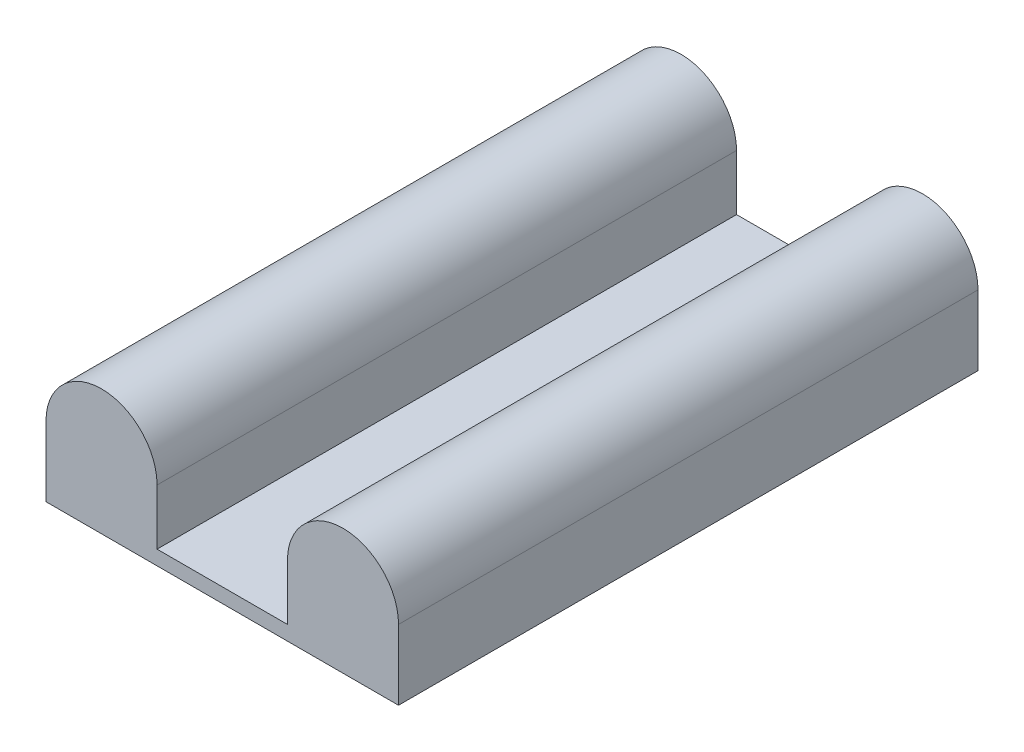
ISO-10303-21;
HEADER;
FILE_DESCRIPTION(('STEP AP214'),'2;1');
FILE_NAME('part.step','',(''),(''),'','','');
FILE_SCHEMA(('AUTOMOTIVE_DESIGN { 1 0 10303 214 1 1 1 1 }'));
ENDSEC;
DATA;
#1=APPLICATION_CONTEXT('core data for automotive mechanical design processes');
#2=APPLICATION_PROTOCOL_DEFINITION('international standard','automotive_design',2000,#1);
#3=PRODUCT_CONTEXT('',#1,'mechanical');
#4=PRODUCT('Part','Part','',(#3));
#5=PRODUCT_RELATED_PRODUCT_CATEGORY('part','',(#4));
#6=PRODUCT_DEFINITION_FORMATION('','',#4);
#7=PRODUCT_DEFINITION_CONTEXT('part definition',#1,'design');
#8=PRODUCT_DEFINITION('design','',#6,#7);
#9=PRODUCT_DEFINITION_SHAPE('','',#8);
#10=(LENGTH_UNIT() NAMED_UNIT(*) SI_UNIT(.MILLI.,.METRE.));
#11=(NAMED_UNIT(*) PLANE_ANGLE_UNIT() SI_UNIT($,.RADIAN.));
#12=(NAMED_UNIT(*) SI_UNIT($,.STERADIAN.) SOLID_ANGLE_UNIT());
#13=UNCERTAINTY_MEASURE_WITH_UNIT(LENGTH_MEASURE(1.E-05),#10,'distance_accuracy_value','');
#14=(GEOMETRIC_REPRESENTATION_CONTEXT(3) GLOBAL_UNCERTAINTY_ASSIGNED_CONTEXT((#13)) GLOBAL_UNIT_ASSIGNED_CONTEXT((#10,
#11,#12)) REPRESENTATION_CONTEXT('',''));
#15=CARTESIAN_POINT('',(0.,0.,0.));
#16=DIRECTION('',(0.,0.,1.));
#17=DIRECTION('',(1.,0.,0.));
#18=AXIS2_PLACEMENT_3D('',#15,#16,#17);
#19=CARTESIAN_POINT('',(0.,0.,120.));
#20=DIRECTION('',(0.,0.,-1.));
#21=DIRECTION('',(-1.,0.,0.));
#22=AXIS2_PLACEMENT_3D('',#19,#20,#21);
#23=CYLINDRICAL_SURFACE('',#22,11.5);
#24=CARTESIAN_POINT('',(0.,0.,0.));
#25=DIRECTION('',(0.,0.,1.));
#26=DIRECTION('',(1.,0.,0.));
#27=AXIS2_PLACEMENT_3D('',#24,#25,#26);
#28=CIRCLE('',#27,11.5);
#29=CARTESIAN_POINT('',(11.5,0.,0.));
#30=VERTEX_POINT('',#29);
#31=CARTESIAN_POINT('',(-11.5,0.,0.));
#32=VERTEX_POINT('',#31);
#33=EDGE_CURVE('E169',#30,#32,#28,.T.);
#34=ORIENTED_EDGE('',*,*,#33,.T.);
#35=DIRECTION('',(0.,0.,-1.));
#36=VECTOR('',#35,1.);
#37=CARTESIAN_POINT('',(-11.5,0.,120.));
#38=LINE('',#37,#36);
#39=CARTESIAN_POINT('',(-11.5,0.,120.));
#40=VERTEX_POINT('',#39);
#41=EDGE_CURVE('E102',#40,#32,#38,.T.);
#42=ORIENTED_EDGE('',*,*,#41,.F.);
#43=CARTESIAN_POINT('',(0.,0.,120.));
#44=DIRECTION('',(0.,0.,1.));
#45=DIRECTION('',(1.,0.,0.));
#46=AXIS2_PLACEMENT_3D('',#43,#44,#45);
#47=CIRCLE('',#46,11.5);
#48=CARTESIAN_POINT('',(11.5,0.,120.));
#49=VERTEX_POINT('',#48);
#50=EDGE_CURVE('E214',#49,#40,#47,.T.);
#51=ORIENTED_EDGE('',*,*,#50,.F.);
#52=DIRECTION('',(0.,0.,-1.));
#53=VECTOR('',#52,1.);
#54=CARTESIAN_POINT('',(11.5,0.,120.));
#55=LINE('',#54,#53);
#56=EDGE_CURVE('E12',#49,#30,#55,.T.);
#57=ORIENTED_EDGE('',*,*,#56,.T.);
#58=EDGE_LOOP('',(#34,#42,#51,#57));
#59=FACE_BOUND('',#58,.T.);
#60=ADVANCED_FACE('F92',(#59),#23,.T.);
#61=CARTESIAN_POINT('',(-11.5,0.,120.));
#62=DIRECTION('',(-1.,0.,0.));
#63=DIRECTION('',(0.,0.,1.));
#64=AXIS2_PLACEMENT_3D('',#61,#62,#63);
#65=PLANE('',#64);
#66=DIRECTION('',(0.,1.,0.));
#67=VECTOR('',#66,1.);
#68=CARTESIAN_POINT('',(-11.5,0.,0.));
#69=LINE('',#68,#67);
#70=CARTESIAN_POINT('',(-11.5,-14.5,0.));
#71=VERTEX_POINT('',#70);
#72=EDGE_CURVE('E159',#71,#32,#69,.T.);
#73=ORIENTED_EDGE('',*,*,#72,.F.);
#74=DIRECTION('',(0.,0.,-1.));
#75=VECTOR('',#74,1.);
#76=CARTESIAN_POINT('',(-11.5,-14.5,120.));
#77=LINE('',#76,#75);
#78=CARTESIAN_POINT('',(-11.5,-14.5,120.));
#79=VERTEX_POINT('',#78);
#80=EDGE_CURVE('E163',#79,#71,#77,.T.);
#81=ORIENTED_EDGE('',*,*,#80,.F.);
#82=DIRECTION('',(0.,1.,0.));
#83=VECTOR('',#82,1.);
#84=CARTESIAN_POINT('',(-11.5,0.,120.));
#85=LINE('',#84,#83);
#86=EDGE_CURVE('E209',#79,#40,#85,.T.);
#87=ORIENTED_EDGE('',*,*,#86,.T.);
#88=ORIENTED_EDGE('',*,*,#41,.T.);
#89=EDGE_LOOP('',(#73,#81,#87,#88));
#90=FACE_BOUND('',#89,.T.);
#91=ADVANCED_FACE('F161',(#90),#65,.T.);
#92=CARTESIAN_POINT('',(11.5,0.,120.));
#93=DIRECTION('',(1.,0.,0.));
#94=DIRECTION('',(0.,0.,-1.));
#95=AXIS2_PLACEMENT_3D('',#92,#93,#94);
#96=PLANE('',#95);
#97=DIRECTION('',(0.,-1.,0.));
#98=VECTOR('',#97,1.);
#99=CARTESIAN_POINT('',(11.5,0.,0.));
#100=LINE('',#99,#98);
#101=CARTESIAN_POINT('',(11.5,-11.5,0.));
#102=VERTEX_POINT('',#101);
#103=EDGE_CURVE('E188',#30,#102,#100,.T.);
#104=ORIENTED_EDGE('',*,*,#103,.F.);
#105=ORIENTED_EDGE('',*,*,#56,.F.);
#106=DIRECTION('',(0.,-1.,0.));
#107=VECTOR('',#106,1.);
#108=CARTESIAN_POINT('',(11.5,0.,120.));
#109=LINE('',#108,#107);
#110=CARTESIAN_POINT('',(11.5,-11.5,120.));
#111=VERTEX_POINT('',#110);
#112=EDGE_CURVE('E168',#49,#111,#109,.T.);
#113=ORIENTED_EDGE('',*,*,#112,.T.);
#114=DIRECTION('',(0.,0.,-1.));
#115=VECTOR('',#114,1.);
#116=CARTESIAN_POINT('',(11.5,-11.5,120.));
#117=LINE('',#116,#115);
#118=EDGE_CURVE('E111',#111,#102,#117,.T.);
#119=ORIENTED_EDGE('',*,*,#118,.T.);
#120=EDGE_LOOP('',(#104,#105,#113,#119));
#121=FACE_BOUND('',#120,.T.);
#122=ADVANCED_FACE('F221',(#121),#96,.T.);
#123=CARTESIAN_POINT('',(0.,0.,0.));
#124=DIRECTION('',(0.,0.,1.));
#125=DIRECTION('',(1.,0.,0.));
#126=AXIS2_PLACEMENT_3D('',#123,#124,#125);
#127=PLANE('',#126);
#128=ORIENTED_EDGE('',*,*,#103,.T.);
#129=DIRECTION('',(1.,0.,0.));
#130=VECTOR('',#129,1.);
#131=CARTESIAN_POINT('',(-11.5,-11.5,0.));
#132=LINE('',#131,#130);
#133=CARTESIAN_POINT('',(38.5,-11.5,0.));
#134=VERTEX_POINT('',#133);
#135=EDGE_CURVE('E180',#102,#134,#132,.T.);
#136=ORIENTED_EDGE('',*,*,#135,.T.);
#137=DIRECTION('',(0.,-1.,0.));
#138=VECTOR('',#137,1.);
#139=CARTESIAN_POINT('',(38.5,0.,0.));
#140=LINE('',#139,#138);
#141=CARTESIAN_POINT('',(38.5,0.,0.));
#142=VERTEX_POINT('',#141);
#143=EDGE_CURVE('E196',#142,#134,#140,.T.);
#144=ORIENTED_EDGE('',*,*,#143,.F.);
#145=CARTESIAN_POINT('',(50.,0.,0.));
#146=DIRECTION('',(0.,0.,1.));
#147=DIRECTION('',(1.,0.,0.));
#148=AXIS2_PLACEMENT_3D('',#145,#146,#147);
#149=CIRCLE('',#148,11.5);
#150=CARTESIAN_POINT('',(61.5,0.,0.));
#151=VERTEX_POINT('',#150);
#152=EDGE_CURVE('E200',#151,#142,#149,.T.);
#153=ORIENTED_EDGE('',*,*,#152,.F.);
#154=DIRECTION('',(0.,-1.,0.));
#155=VECTOR('',#154,1.);
#156=CARTESIAN_POINT('',(61.5,0.,0.));
#157=LINE('',#156,#155);
#158=CARTESIAN_POINT('',(61.5,-14.5,0.));
#159=VERTEX_POINT('',#158);
#160=EDGE_CURVE('E153',#151,#159,#157,.T.);
#161=ORIENTED_EDGE('',*,*,#160,.T.);
#162=DIRECTION('',(1.,0.,0.));
#163=VECTOR('',#162,1.);
#164=CARTESIAN_POINT('',(-11.5,-14.5,0.));
#165=LINE('',#164,#163);
#166=EDGE_CURVE('E174',#71,#159,#165,.T.);
#167=ORIENTED_EDGE('',*,*,#166,.F.);
#168=ORIENTED_EDGE('',*,*,#72,.T.);
#169=ORIENTED_EDGE('',*,*,#33,.F.);
#170=EDGE_LOOP('',(#128,#136,#144,#153,#161,#167,#168,#169));
#171=FACE_BOUND('',#170,.T.);
#172=ADVANCED_FACE('F179',(#171),#127,.F.);
#173=CARTESIAN_POINT('',(0.,0.,120.));
#174=DIRECTION('',(0.,0.,1.));
#175=DIRECTION('',(1.,0.,0.));
#176=AXIS2_PLACEMENT_3D('',#173,#174,#175);
#177=PLANE('',#176);
#178=ORIENTED_EDGE('',*,*,#112,.F.);
#179=ORIENTED_EDGE('',*,*,#50,.T.);
#180=ORIENTED_EDGE('',*,*,#86,.F.);
#181=DIRECTION('',(1.,0.,0.));
#182=VECTOR('',#181,1.);
#183=CARTESIAN_POINT('',(-11.5,-14.5,120.));
#184=LINE('',#183,#182);
#185=CARTESIAN_POINT('',(61.5,-14.5,120.));
#186=VERTEX_POINT('',#185);
#187=EDGE_CURVE('E176',#79,#186,#184,.T.);
#188=ORIENTED_EDGE('',*,*,#187,.T.);
#189=DIRECTION('',(0.,-1.,0.));
#190=VECTOR('',#189,1.);
#191=CARTESIAN_POINT('',(61.5,0.,120.));
#192=LINE('',#191,#190);
#193=CARTESIAN_POINT('',(61.5,0.,120.));
#194=VERTEX_POINT('',#193);
#195=EDGE_CURVE('E199',#194,#186,#192,.T.);
#196=ORIENTED_EDGE('',*,*,#195,.F.);
#197=CARTESIAN_POINT('',(50.,0.,120.));
#198=DIRECTION('',(0.,0.,1.));
#199=DIRECTION('',(1.,0.,0.));
#200=AXIS2_PLACEMENT_3D('',#197,#198,#199);
#201=CIRCLE('',#200,11.5);
#202=CARTESIAN_POINT('',(38.5,0.,120.));
#203=VERTEX_POINT('',#202);
#204=EDGE_CURVE('E205',#194,#203,#201,.T.);
#205=ORIENTED_EDGE('',*,*,#204,.T.);
#206=DIRECTION('',(0.,-1.,0.));
#207=VECTOR('',#206,1.);
#208=CARTESIAN_POINT('',(38.5,0.,120.));
#209=LINE('',#208,#207);
#210=CARTESIAN_POINT('',(38.5,-11.5,120.));
#211=VERTEX_POINT('',#210);
#212=EDGE_CURVE('E195',#203,#211,#209,.T.);
#213=ORIENTED_EDGE('',*,*,#212,.T.);
#214=DIRECTION('',(1.,0.,0.));
#215=VECTOR('',#214,1.);
#216=CARTESIAN_POINT('',(-11.5,-11.5,120.));
#217=LINE('',#216,#215);
#218=EDGE_CURVE('E177',#111,#211,#217,.T.);
#219=ORIENTED_EDGE('',*,*,#218,.F.);
#220=EDGE_LOOP('',(#178,#179,#180,#188,#196,#205,#213,#219));
#221=FACE_BOUND('',#220,.T.);
#222=ADVANCED_FACE('F224',(#221),#177,.T.);
#223=CARTESIAN_POINT('',(61.5,0.,120.));
#224=DIRECTION('',(1.,0.,0.));
#225=DIRECTION('',(0.,0.,-1.));
#226=AXIS2_PLACEMENT_3D('',#223,#224,#225);
#227=PLANE('',#226);
#228=ORIENTED_EDGE('',*,*,#160,.F.);
#229=DIRECTION('',(0.,0.,-1.));
#230=VECTOR('',#229,1.);
#231=CARTESIAN_POINT('',(61.5,0.,120.));
#232=LINE('',#231,#230);
#233=EDGE_CURVE('E186',#194,#151,#232,.T.);
#234=ORIENTED_EDGE('',*,*,#233,.F.);
#235=ORIENTED_EDGE('',*,*,#195,.T.);
#236=DIRECTION('',(0.,0.,-1.));
#237=VECTOR('',#236,1.);
#238=CARTESIAN_POINT('',(61.5,-14.5,120.));
#239=LINE('',#238,#237);
#240=EDGE_CURVE('E96',#186,#159,#239,.T.);
#241=ORIENTED_EDGE('',*,*,#240,.T.);
#242=EDGE_LOOP('',(#228,#234,#235,#241));
#243=FACE_BOUND('',#242,.T.);
#244=ADVANCED_FACE('F235',(#243),#227,.T.);
#245=CARTESIAN_POINT('',(50.,0.,120.));
#246=DIRECTION('',(0.,0.,-1.));
#247=DIRECTION('',(-1.,0.,0.));
#248=AXIS2_PLACEMENT_3D('',#245,#246,#247);
#249=CYLINDRICAL_SURFACE('',#248,11.5);
#250=ORIENTED_EDGE('',*,*,#152,.T.);
#251=DIRECTION('',(0.,0.,-1.));
#252=VECTOR('',#251,1.);
#253=CARTESIAN_POINT('',(38.5,0.,120.));
#254=LINE('',#253,#252);
#255=EDGE_CURVE('E189',#203,#142,#254,.T.);
#256=ORIENTED_EDGE('',*,*,#255,.F.);
#257=ORIENTED_EDGE('',*,*,#204,.F.);
#258=ORIENTED_EDGE('',*,*,#233,.T.);
#259=EDGE_LOOP('',(#250,#256,#257,#258));
#260=FACE_BOUND('',#259,.T.);
#261=ADVANCED_FACE('F238',(#260),#249,.T.);
#262=CARTESIAN_POINT('',(38.5,0.,120.));
#263=DIRECTION('',(1.,0.,0.));
#264=DIRECTION('',(0.,0.,-1.));
#265=AXIS2_PLACEMENT_3D('',#262,#263,#264);
#266=PLANE('',#265);
#267=ORIENTED_EDGE('',*,*,#143,.T.);
#268=DIRECTION('',(0.,0.,-1.));
#269=VECTOR('',#268,1.);
#270=CARTESIAN_POINT('',(38.5,-11.5,120.));
#271=LINE('',#270,#269);
#272=EDGE_CURVE('E192',#211,#134,#271,.T.);
#273=ORIENTED_EDGE('',*,*,#272,.F.);
#274=ORIENTED_EDGE('',*,*,#212,.F.);
#275=ORIENTED_EDGE('',*,*,#255,.T.);
#276=EDGE_LOOP('',(#267,#273,#274,#275));
#277=FACE_BOUND('',#276,.T.);
#278=ADVANCED_FACE('F229',(#277),#266,.F.);
#279=CARTESIAN_POINT('',(-11.5,-11.5,120.));
#280=DIRECTION('',(0.,1.,0.));
#281=DIRECTION('',(-1.,0.,0.));
#282=AXIS2_PLACEMENT_3D('',#279,#280,#281);
#283=PLANE('',#282);
#284=ORIENTED_EDGE('',*,*,#118,.F.);
#285=ORIENTED_EDGE('',*,*,#218,.T.);
#286=ORIENTED_EDGE('',*,*,#272,.T.);
#287=ORIENTED_EDGE('',*,*,#135,.F.);
#288=EDGE_LOOP('',(#284,#285,#286,#287));
#289=FACE_BOUND('',#288,.T.);
#290=ADVANCED_FACE('F227',(#289),#283,.T.);
#291=CARTESIAN_POINT('',(-11.5,-14.5,120.));
#292=DIRECTION('',(0.,1.,0.));
#293=DIRECTION('',(-1.,0.,0.));
#294=AXIS2_PLACEMENT_3D('',#291,#292,#293);
#295=PLANE('',#294);
#296=ORIENTED_EDGE('',*,*,#166,.T.);
#297=ORIENTED_EDGE('',*,*,#240,.F.);
#298=ORIENTED_EDGE('',*,*,#187,.F.);
#299=ORIENTED_EDGE('',*,*,#80,.T.);
#300=EDGE_LOOP('',(#296,#297,#298,#299));
#301=FACE_BOUND('',#300,.T.);
#302=ADVANCED_FACE('F94',(#301),#295,.F.);
#303=CLOSED_SHELL('',(#60,#91,#122,#172,#222,#244,#261,#278,#290,#302));
#304=MANIFOLD_SOLID_BREP('B2',#303);
#305=ADVANCED_BREP_SHAPE_REPRESENTATION('',(#18,#304),#14);
#306=SHAPE_DEFINITION_REPRESENTATION(#9,#305);
ENDSEC;
END-ISO-10303-21;
